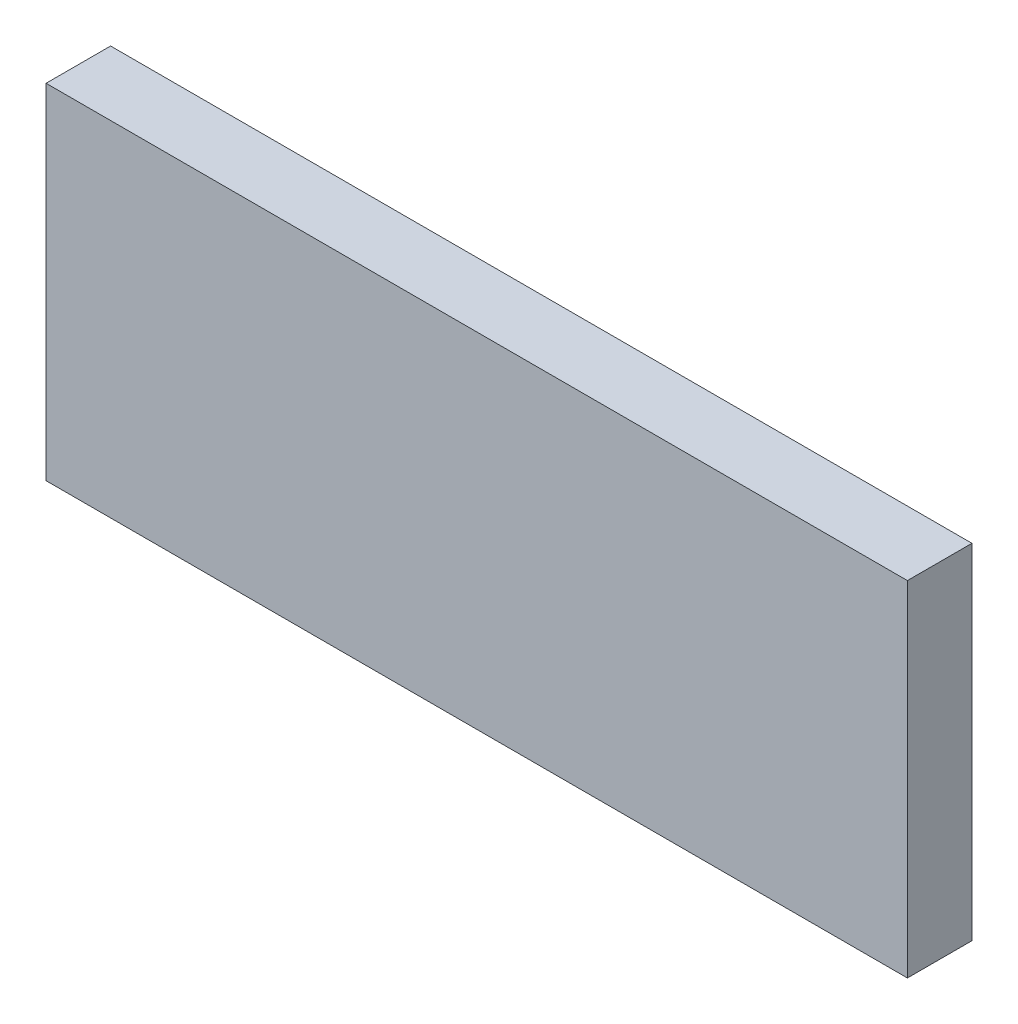
ISO-10303-21;
HEADER;
FILE_DESCRIPTION(('STEP AP214'),'2;1');
FILE_NAME('part.step','',(''),(''),'','','');
FILE_SCHEMA(('AUTOMOTIVE_DESIGN { 1 0 10303 214 1 1 1 1 }'));
ENDSEC;
DATA;
#1=APPLICATION_CONTEXT('core data for automotive mechanical design processes');
#2=APPLICATION_PROTOCOL_DEFINITION('international standard','automotive_design',2000,#1);
#3=PRODUCT_CONTEXT('',#1,'mechanical');
#4=PRODUCT('Part','Part','',(#3));
#5=PRODUCT_RELATED_PRODUCT_CATEGORY('part','',(#4));
#6=PRODUCT_DEFINITION_FORMATION('','',#4);
#7=PRODUCT_DEFINITION_CONTEXT('part definition',#1,'design');
#8=PRODUCT_DEFINITION('design','',#6,#7);
#9=PRODUCT_DEFINITION_SHAPE('','',#8);
#10=(LENGTH_UNIT() NAMED_UNIT(*) SI_UNIT(.MILLI.,.METRE.));
#11=(NAMED_UNIT(*) PLANE_ANGLE_UNIT() SI_UNIT($,.RADIAN.));
#12=(NAMED_UNIT(*) SI_UNIT($,.STERADIAN.) SOLID_ANGLE_UNIT());
#13=UNCERTAINTY_MEASURE_WITH_UNIT(LENGTH_MEASURE(1.E-05),#10,'distance_accuracy_value','');
#14=(GEOMETRIC_REPRESENTATION_CONTEXT(3) GLOBAL_UNCERTAINTY_ASSIGNED_CONTEXT((#13)) GLOBAL_UNIT_ASSIGNED_CONTEXT((#10,
#11,#12)) REPRESENTATION_CONTEXT('',''));
#15=CARTESIAN_POINT('',(0.,0.,0.));
#16=DIRECTION('',(0.,0.,1.));
#17=DIRECTION('',(1.,0.,0.));
#18=AXIS2_PLACEMENT_3D('',#15,#16,#17);
#19=CARTESIAN_POINT('',(200.2,-40.,-7.5));
#20=DIRECTION('',(0.,0.,1.));
#21=DIRECTION('',(1.,0.,0.));
#22=AXIS2_PLACEMENT_3D('',#19,#20,#21);
#23=PLANE('',#22);
#24=DIRECTION('',(0.,1.,0.));
#25=VECTOR('',#24,1.);
#26=CARTESIAN_POINT('',(0.,-40.,-7.5));
#27=LINE('',#26,#25);
#28=CARTESIAN_POINT('',(0.,-40.,-7.5));
#29=VERTEX_POINT('',#28);
#30=CARTESIAN_POINT('',(0.,40.,-7.5));
#31=VERTEX_POINT('',#30);
#32=EDGE_CURVE('E107',#29,#31,#27,.T.);
#33=ORIENTED_EDGE('',*,*,#32,.T.);
#34=DIRECTION('',(-1.,0.,0.));
#35=VECTOR('',#34,1.);
#36=CARTESIAN_POINT('',(200.2,40.,-7.5));
#37=LINE('',#36,#35);
#38=CARTESIAN_POINT('',(200.2,40.,-7.5));
#39=VERTEX_POINT('',#38);
#40=EDGE_CURVE('E11',#39,#31,#37,.T.);
#41=ORIENTED_EDGE('',*,*,#40,.F.);
#42=DIRECTION('',(0.,1.,0.));
#43=VECTOR('',#42,1.);
#44=CARTESIAN_POINT('',(200.2,-40.,-7.5));
#45=LINE('',#44,#43);
#46=CARTESIAN_POINT('',(200.2,-40.,-7.5));
#47=VERTEX_POINT('',#46);
#48=EDGE_CURVE('E91',#47,#39,#45,.T.);
#49=ORIENTED_EDGE('',*,*,#48,.F.);
#50=DIRECTION('',(-1.,0.,0.));
#51=VECTOR('',#50,1.);
#52=CARTESIAN_POINT('',(200.2,-40.,-7.5));
#53=LINE('',#52,#51);
#54=EDGE_CURVE('E103',#47,#29,#53,.T.);
#55=ORIENTED_EDGE('',*,*,#54,.T.);
#56=EDGE_LOOP('',(#33,#41,#49,#55));
#57=FACE_BOUND('',#56,.T.);
#58=ADVANCED_FACE('F39',(#57),#23,.F.);
#59=CARTESIAN_POINT('',(200.2,40.,7.5));
#60=DIRECTION('',(0.,-1.,0.));
#61=DIRECTION('',(0.,0.,-1.));
#62=AXIS2_PLACEMENT_3D('',#59,#60,#61);
#63=PLANE('',#62);
#64=DIRECTION('',(0.,0.,1.));
#65=VECTOR('',#64,1.);
#66=CARTESIAN_POINT('',(0.,40.,7.5));
#67=LINE('',#66,#65);
#68=CARTESIAN_POINT('',(0.,40.,7.5));
#69=VERTEX_POINT('',#68);
#70=EDGE_CURVE('E96',#31,#69,#67,.T.);
#71=ORIENTED_EDGE('',*,*,#70,.T.);
#72=DIRECTION('',(-1.,0.,0.));
#73=VECTOR('',#72,1.);
#74=CARTESIAN_POINT('',(200.2,40.,7.5));
#75=LINE('',#74,#73);
#76=CARTESIAN_POINT('',(200.2,40.,7.5));
#77=VERTEX_POINT('',#76);
#78=EDGE_CURVE('E48',#77,#69,#75,.T.);
#79=ORIENTED_EDGE('',*,*,#78,.F.);
#80=DIRECTION('',(0.,0.,1.));
#81=VECTOR('',#80,1.);
#82=CARTESIAN_POINT('',(200.2,40.,7.5));
#83=LINE('',#82,#81);
#84=EDGE_CURVE('E86',#39,#77,#83,.T.);
#85=ORIENTED_EDGE('',*,*,#84,.F.);
#86=ORIENTED_EDGE('',*,*,#40,.T.);
#87=EDGE_LOOP('',(#71,#79,#85,#86));
#88=FACE_BOUND('',#87,.T.);
#89=ADVANCED_FACE('F95',(#88),#63,.F.);
#90=CARTESIAN_POINT('',(200.2,-40.,7.5));
#91=DIRECTION('',(0.,0.,-1.));
#92=DIRECTION('',(-1.,0.,0.));
#93=AXIS2_PLACEMENT_3D('',#90,#91,#92);
#94=PLANE('',#93);
#95=DIRECTION('',(0.,-1.,0.));
#96=VECTOR('',#95,1.);
#97=CARTESIAN_POINT('',(0.,-40.,7.5));
#98=LINE('',#97,#96);
#99=CARTESIAN_POINT('',(0.,-40.,7.5));
#100=VERTEX_POINT('',#99);
#101=EDGE_CURVE('E73',#69,#100,#98,.T.);
#102=ORIENTED_EDGE('',*,*,#101,.T.);
#103=DIRECTION('',(-1.,0.,0.));
#104=VECTOR('',#103,1.);
#105=CARTESIAN_POINT('',(200.2,-40.,7.5));
#106=LINE('',#105,#104);
#107=CARTESIAN_POINT('',(200.2,-40.,7.5));
#108=VERTEX_POINT('',#107);
#109=EDGE_CURVE('E98',#108,#100,#106,.T.);
#110=ORIENTED_EDGE('',*,*,#109,.F.);
#111=DIRECTION('',(0.,-1.,0.));
#112=VECTOR('',#111,1.);
#113=CARTESIAN_POINT('',(200.2,-40.,7.5));
#114=LINE('',#113,#112);
#115=EDGE_CURVE('E89',#77,#108,#114,.T.);
#116=ORIENTED_EDGE('',*,*,#115,.F.);
#117=ORIENTED_EDGE('',*,*,#78,.T.);
#118=EDGE_LOOP('',(#102,#110,#116,#117));
#119=FACE_BOUND('',#118,.T.);
#120=ADVANCED_FACE('F99',(#119),#94,.F.);
#121=CARTESIAN_POINT('',(200.2,-40.,7.5));
#122=DIRECTION('',(0.,1.,0.));
#123=DIRECTION('',(0.,0.,1.));
#124=AXIS2_PLACEMENT_3D('',#121,#122,#123);
#125=PLANE('',#124);
#126=DIRECTION('',(0.,0.,-1.));
#127=VECTOR('',#126,1.);
#128=CARTESIAN_POINT('',(0.,-40.,7.5));
#129=LINE('',#128,#127);
#130=EDGE_CURVE('E79',#100,#29,#129,.T.);
#131=ORIENTED_EDGE('',*,*,#130,.T.);
#132=ORIENTED_EDGE('',*,*,#54,.F.);
#133=DIRECTION('',(0.,0.,-1.));
#134=VECTOR('',#133,1.);
#135=CARTESIAN_POINT('',(200.2,-40.,7.5));
#136=LINE('',#135,#134);
#137=EDGE_CURVE('E56',#108,#47,#136,.T.);
#138=ORIENTED_EDGE('',*,*,#137,.F.);
#139=ORIENTED_EDGE('',*,*,#109,.T.);
#140=EDGE_LOOP('',(#131,#132,#138,#139));
#141=FACE_BOUND('',#140,.T.);
#142=ADVANCED_FACE('F120',(#141),#125,.F.);
#143=CARTESIAN_POINT('',(200.2,0.,0.));
#144=DIRECTION('',(-1.,0.,0.));
#145=DIRECTION('',(0.,0.,1.));
#146=AXIS2_PLACEMENT_3D('',#143,#144,#145);
#147=PLANE('',#146);
#148=ORIENTED_EDGE('',*,*,#48,.T.);
#149=ORIENTED_EDGE('',*,*,#84,.T.);
#150=ORIENTED_EDGE('',*,*,#115,.T.);
#151=ORIENTED_EDGE('',*,*,#137,.T.);
#152=EDGE_LOOP('',(#148,#149,#150,#151));
#153=FACE_BOUND('',#152,.T.);
#154=ADVANCED_FACE('F87',(#153),#147,.F.);
#155=CARTESIAN_POINT('',(0.,0.,0.));
#156=DIRECTION('',(-1.,0.,0.));
#157=DIRECTION('',(0.,0.,1.));
#158=AXIS2_PLACEMENT_3D('',#155,#156,#157);
#159=PLANE('',#158);
#160=ORIENTED_EDGE('',*,*,#32,.F.);
#161=ORIENTED_EDGE('',*,*,#130,.F.);
#162=ORIENTED_EDGE('',*,*,#101,.F.);
#163=ORIENTED_EDGE('',*,*,#70,.F.);
#164=EDGE_LOOP('',(#160,#161,#162,#163));
#165=FACE_BOUND('',#164,.T.);
#166=ADVANCED_FACE('F123',(#165),#159,.T.);
#167=CLOSED_SHELL('',(#58,#89,#120,#142,#154,#166));
#168=MANIFOLD_SOLID_BREP('B2',#167);
#169=ADVANCED_BREP_SHAPE_REPRESENTATION('',(#18,#168),#14);
#170=SHAPE_DEFINITION_REPRESENTATION(#9,#169);
ENDSEC;
END-ISO-10303-21;
